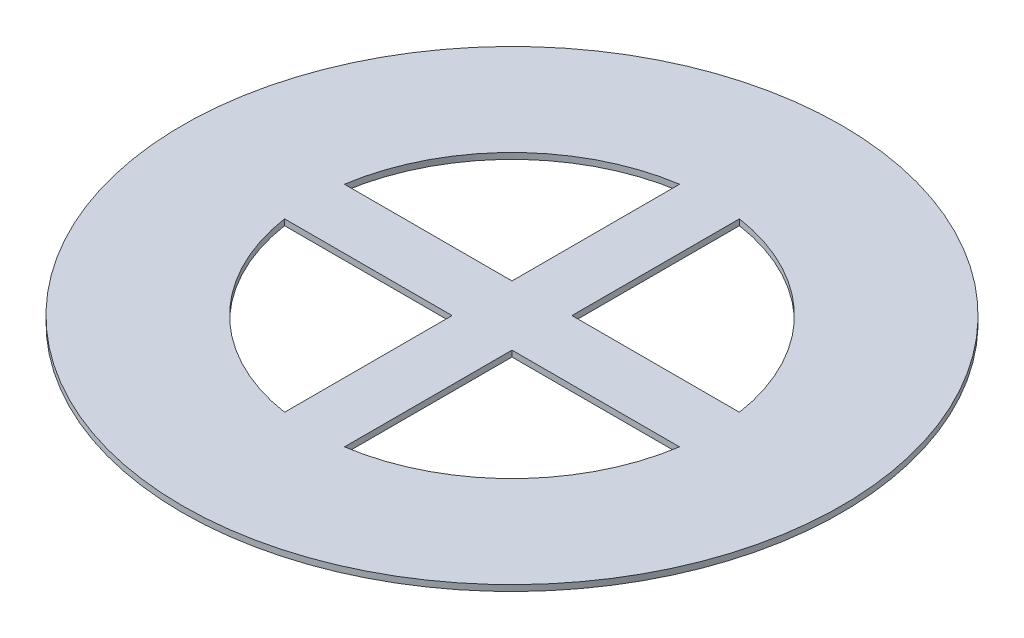
ISO-10303-21;
HEADER;
FILE_DESCRIPTION(('STEP AP214'),'2;1');
FILE_NAME('part.step','',(''),(''),'','','');
FILE_SCHEMA(('AUTOMOTIVE_DESIGN { 1 0 10303 214 1 1 1 1 }'));
ENDSEC;
DATA;
#1=APPLICATION_CONTEXT('core data for automotive mechanical design processes');
#2=APPLICATION_PROTOCOL_DEFINITION('international standard','automotive_design',2000,#1);
#3=PRODUCT_CONTEXT('',#1,'mechanical');
#4=PRODUCT('Part','Part','',(#3));
#5=PRODUCT_RELATED_PRODUCT_CATEGORY('part','',(#4));
#6=PRODUCT_DEFINITION_FORMATION('','',#4);
#7=PRODUCT_DEFINITION_CONTEXT('part definition',#1,'design');
#8=PRODUCT_DEFINITION('design','',#6,#7);
#9=PRODUCT_DEFINITION_SHAPE('','',#8);
#10=(LENGTH_UNIT() NAMED_UNIT(*) SI_UNIT(.MILLI.,.METRE.));
#11=(NAMED_UNIT(*) PLANE_ANGLE_UNIT() SI_UNIT($,.RADIAN.));
#12=(NAMED_UNIT(*) SI_UNIT($,.STERADIAN.) SOLID_ANGLE_UNIT());
#13=UNCERTAINTY_MEASURE_WITH_UNIT(LENGTH_MEASURE(1.E-05),#10,'distance_accuracy_value','');
#14=(GEOMETRIC_REPRESENTATION_CONTEXT(3) GLOBAL_UNCERTAINTY_ASSIGNED_CONTEXT((#13)) GLOBAL_UNIT_ASSIGNED_CONTEXT((#10,
#11,#12)) REPRESENTATION_CONTEXT('',''));
#15=CARTESIAN_POINT('',(0.,0.,0.));
#16=DIRECTION('',(0.,0.,1.));
#17=DIRECTION('',(1.,0.,0.));
#18=AXIS2_PLACEMENT_3D('',#15,#16,#17);
#19=CARTESIAN_POINT('',(0.,3.,0.));
#20=DIRECTION('',(0.,1.,0.));
#21=DIRECTION('',(0.,0.,1.));
#22=AXIS2_PLACEMENT_3D('',#19,#20,#21);
#23=PLANE('',#22);
#24=CARTESIAN_POINT('',(0.,3.,0.));
#25=DIRECTION('',(0.,1.,0.));
#26=DIRECTION('',(0.,0.,1.));
#27=AXIS2_PLACEMENT_3D('',#24,#25,#26);
#28=CIRCLE('',#27,165.);
#29=CARTESIAN_POINT('',(0.,3.,165.));
#30=VERTEX_POINT('',#29);
#31=EDGE_CURVE('E11',#30,#30,#28,.T.);
#32=ORIENTED_EDGE('',*,*,#31,.T.);
#33=EDGE_LOOP('',(#32));
#34=FACE_BOUND('',#33,.T.);
#35=DIRECTION('',(1.,0.,0.));
#36=VECTOR('',#35,1.);
#37=CARTESIAN_POINT('',(-98.868599666426,3.,-15.));
#38=LINE('',#37,#36);
#39=CARTESIAN_POINT('',(-98.868599666426,3.,-15.));
#40=VERTEX_POINT('',#39);
#41=CARTESIAN_POINT('',(-15.,3.,-15.));
#42=VERTEX_POINT('',#41);
#43=EDGE_CURVE('E234',#40,#42,#38,.T.);
#44=ORIENTED_EDGE('',*,*,#43,.F.);
#45=CARTESIAN_POINT('',(0.,3.,0.));
#46=DIRECTION('',(0.,1.,0.));
#47=DIRECTION('',(0.,0.,1.));
#48=AXIS2_PLACEMENT_3D('',#45,#46,#47);
#49=CIRCLE('',#48,100.);
#50=CARTESIAN_POINT('',(-15.,3.,-98.868599666426));
#51=VERTEX_POINT('',#50);
#52=EDGE_CURVE('E231',#51,#40,#49,.T.);
#53=ORIENTED_EDGE('',*,*,#52,.F.);
#54=DIRECTION('',(0.,0.,-1.));
#55=VECTOR('',#54,1.);
#56=CARTESIAN_POINT('',(-15.,3.,-98.868599666426));
#57=LINE('',#56,#55);
#58=EDGE_CURVE('E239',#42,#51,#57,.T.);
#59=ORIENTED_EDGE('',*,*,#58,.F.);
#60=EDGE_LOOP('',(#44,#53,#59));
#61=FACE_BOUND('',#60,.T.);
#62=DIRECTION('',(0.,0.,-1.));
#63=VECTOR('',#62,1.);
#64=CARTESIAN_POINT('',(-15.,3.,15.));
#65=LINE('',#64,#63);
#66=CARTESIAN_POINT('',(-15.,3.,98.868599666426));
#67=VERTEX_POINT('',#66);
#68=CARTESIAN_POINT('',(-15.,3.,15.));
#69=VERTEX_POINT('',#68);
#70=EDGE_CURVE('E201',#67,#69,#65,.T.);
#71=ORIENTED_EDGE('',*,*,#70,.F.);
#72=CARTESIAN_POINT('',(0.,3.,0.));
#73=DIRECTION('',(0.,1.,0.));
#74=DIRECTION('',(0.,0.,1.));
#75=AXIS2_PLACEMENT_3D('',#72,#73,#74);
#76=CIRCLE('',#75,100.);
#77=CARTESIAN_POINT('',(-98.868599666426,3.,15.));
#78=VERTEX_POINT('',#77);
#79=EDGE_CURVE('E198',#78,#67,#76,.T.);
#80=ORIENTED_EDGE('',*,*,#79,.F.);
#81=DIRECTION('',(-1.,0.,0.));
#82=VECTOR('',#81,1.);
#83=CARTESIAN_POINT('',(-98.868599666426,3.,15.));
#84=LINE('',#83,#82);
#85=EDGE_CURVE('E206',#69,#78,#84,.T.);
#86=ORIENTED_EDGE('',*,*,#85,.F.);
#87=EDGE_LOOP('',(#71,#80,#86));
#88=FACE_BOUND('',#87,.T.);
#89=CARTESIAN_POINT('',(0.,3.,0.));
#90=DIRECTION('',(0.,1.,0.));
#91=DIRECTION('',(0.,0.,1.));
#92=AXIS2_PLACEMENT_3D('',#89,#90,#91);
#93=CIRCLE('',#92,100.);
#94=CARTESIAN_POINT('',(98.868599666426,3.,-15.));
#95=VERTEX_POINT('',#94);
#96=CARTESIAN_POINT('',(15.,3.,-98.868599666426));
#97=VERTEX_POINT('',#96);
#98=EDGE_CURVE('E168',#95,#97,#93,.T.);
#99=ORIENTED_EDGE('',*,*,#98,.F.);
#100=DIRECTION('',(1.,0.,0.));
#101=VECTOR('',#100,1.);
#102=CARTESIAN_POINT('',(15.,3.,-15.));
#103=LINE('',#102,#101);
#104=CARTESIAN_POINT('',(15.,3.,-15.));
#105=VERTEX_POINT('',#104);
#106=EDGE_CURVE('E165',#105,#95,#103,.T.);
#107=ORIENTED_EDGE('',*,*,#106,.F.);
#108=DIRECTION('',(0.,0.,1.));
#109=VECTOR('',#108,1.);
#110=CARTESIAN_POINT('',(15.,3.,-98.868599666426));
#111=LINE('',#110,#109);
#112=EDGE_CURVE('E173',#97,#105,#111,.T.);
#113=ORIENTED_EDGE('',*,*,#112,.F.);
#114=EDGE_LOOP('',(#99,#107,#113));
#115=FACE_BOUND('',#114,.T.);
#116=DIRECTION('',(0.,0.,1.));
#117=VECTOR('',#116,1.);
#118=CARTESIAN_POINT('',(15.,3.,15.));
#119=LINE('',#118,#117);
#120=CARTESIAN_POINT('',(15.,3.,15.));
#121=VERTEX_POINT('',#120);
#122=CARTESIAN_POINT('',(15.,3.,98.868599666426));
#123=VERTEX_POINT('',#122);
#124=EDGE_CURVE('E138',#121,#123,#119,.T.);
#125=ORIENTED_EDGE('',*,*,#124,.F.);
#126=DIRECTION('',(-1.,0.,0.));
#127=VECTOR('',#126,1.);
#128=CARTESIAN_POINT('',(15.,3.,15.));
#129=LINE('',#128,#127);
#130=CARTESIAN_POINT('',(98.868599666426,3.,15.));
#131=VERTEX_POINT('',#130);
#132=EDGE_CURVE('E129',#131,#121,#129,.T.);
#133=ORIENTED_EDGE('',*,*,#132,.F.);
#134=CARTESIAN_POINT('',(0.,3.,0.));
#135=DIRECTION('',(0.,1.,0.));
#136=DIRECTION('',(0.,0.,1.));
#137=AXIS2_PLACEMENT_3D('',#134,#135,#136);
#138=CIRCLE('',#137,100.);
#139=EDGE_CURVE('E148',#123,#131,#138,.T.);
#140=ORIENTED_EDGE('',*,*,#139,.F.);
#141=EDGE_LOOP('',(#125,#133,#140));
#142=FACE_BOUND('',#141,.T.);
#143=ADVANCED_FACE('F39',(#34,#61,#88,#115,#142),#23,.T.);
#144=CARTESIAN_POINT('',(0.,0.,0.));
#145=DIRECTION('',(0.,1.,0.));
#146=DIRECTION('',(0.,0.,1.));
#147=AXIS2_PLACEMENT_3D('',#144,#145,#146);
#148=PLANE('',#147);
#149=DIRECTION('',(1.,0.,0.));
#150=VECTOR('',#149,1.);
#151=CARTESIAN_POINT('',(15.,0.,-15.));
#152=LINE('',#151,#150);
#153=CARTESIAN_POINT('',(15.,0.,-15.));
#154=VERTEX_POINT('',#153);
#155=CARTESIAN_POINT('',(98.868599666426,0.,-15.));
#156=VERTEX_POINT('',#155);
#157=EDGE_CURVE('E146',#154,#156,#152,.T.);
#158=ORIENTED_EDGE('',*,*,#157,.T.);
#159=CARTESIAN_POINT('',(0.,0.,0.));
#160=DIRECTION('',(0.,1.,0.));
#161=DIRECTION('',(0.,0.,1.));
#162=AXIS2_PLACEMENT_3D('',#159,#160,#161);
#163=CIRCLE('',#162,100.);
#164=CARTESIAN_POINT('',(15.,0.,-98.868599666426));
#165=VERTEX_POINT('',#164);
#166=EDGE_CURVE('E180',#156,#165,#163,.T.);
#167=ORIENTED_EDGE('',*,*,#166,.T.);
#168=DIRECTION('',(0.,0.,1.));
#169=VECTOR('',#168,1.);
#170=CARTESIAN_POINT('',(15.,0.,-98.868599666426));
#171=LINE('',#170,#169);
#172=EDGE_CURVE('E169',#165,#154,#171,.T.);
#173=ORIENTED_EDGE('',*,*,#172,.T.);
#174=EDGE_LOOP('',(#158,#167,#173));
#175=FACE_BOUND('',#174,.T.);
#176=CARTESIAN_POINT('',(0.,0.,0.));
#177=DIRECTION('',(0.,1.,0.));
#178=DIRECTION('',(0.,0.,1.));
#179=AXIS2_PLACEMENT_3D('',#176,#177,#178);
#180=CIRCLE('',#179,100.);
#181=CARTESIAN_POINT('',(-15.,0.,-98.868599666426));
#182=VERTEX_POINT('',#181);
#183=CARTESIAN_POINT('',(-98.868599666426,0.,-15.));
#184=VERTEX_POINT('',#183);
#185=EDGE_CURVE('E230',#182,#184,#180,.T.);
#186=ORIENTED_EDGE('',*,*,#185,.T.);
#187=DIRECTION('',(1.,0.,0.));
#188=VECTOR('',#187,1.);
#189=CARTESIAN_POINT('',(-98.868599666426,0.,-15.));
#190=LINE('',#189,#188);
#191=CARTESIAN_POINT('',(-15.,0.,-15.));
#192=VERTEX_POINT('',#191);
#193=EDGE_CURVE('E246',#184,#192,#190,.T.);
#194=ORIENTED_EDGE('',*,*,#193,.T.);
#195=DIRECTION('',(0.,0.,-1.));
#196=VECTOR('',#195,1.);
#197=CARTESIAN_POINT('',(-15.,0.,-98.868599666426));
#198=LINE('',#197,#196);
#199=EDGE_CURVE('E235',#192,#182,#198,.T.);
#200=ORIENTED_EDGE('',*,*,#199,.T.);
#201=EDGE_LOOP('',(#186,#194,#200));
#202=FACE_BOUND('',#201,.T.);
#203=CARTESIAN_POINT('',(0.,0.,0.));
#204=DIRECTION('',(0.,1.,0.));
#205=DIRECTION('',(0.,0.,1.));
#206=AXIS2_PLACEMENT_3D('',#203,#204,#205);
#207=CIRCLE('',#206,165.);
#208=CARTESIAN_POINT('',(0.,0.,165.));
#209=VERTEX_POINT('',#208);
#210=EDGE_CURVE('E43',#209,#209,#207,.T.);
#211=ORIENTED_EDGE('',*,*,#210,.F.);
#212=EDGE_LOOP('',(#211));
#213=FACE_BOUND('',#212,.T.);
#214=CARTESIAN_POINT('',(0.,0.,0.));
#215=DIRECTION('',(0.,1.,0.));
#216=DIRECTION('',(0.,0.,1.));
#217=AXIS2_PLACEMENT_3D('',#214,#215,#216);
#218=CIRCLE('',#217,100.);
#219=CARTESIAN_POINT('',(-98.868599666426,0.,15.));
#220=VERTEX_POINT('',#219);
#221=CARTESIAN_POINT('',(-15.,0.,98.868599666426));
#222=VERTEX_POINT('',#221);
#223=EDGE_CURVE('E197',#220,#222,#218,.T.);
#224=ORIENTED_EDGE('',*,*,#223,.T.);
#225=DIRECTION('',(0.,0.,-1.));
#226=VECTOR('',#225,1.);
#227=CARTESIAN_POINT('',(-15.,0.,15.));
#228=LINE('',#227,#226);
#229=CARTESIAN_POINT('',(-15.,0.,15.));
#230=VERTEX_POINT('',#229);
#231=EDGE_CURVE('E213',#222,#230,#228,.T.);
#232=ORIENTED_EDGE('',*,*,#231,.T.);
#233=DIRECTION('',(-1.,0.,0.));
#234=VECTOR('',#233,1.);
#235=CARTESIAN_POINT('',(-98.868599666426,0.,15.));
#236=LINE('',#235,#234);
#237=EDGE_CURVE('E202',#230,#220,#236,.T.);
#238=ORIENTED_EDGE('',*,*,#237,.T.);
#239=EDGE_LOOP('',(#224,#232,#238));
#240=FACE_BOUND('',#239,.T.);
#241=DIRECTION('',(-1.,0.,0.));
#242=VECTOR('',#241,1.);
#243=CARTESIAN_POINT('',(15.,0.,15.));
#244=LINE('',#243,#242);
#245=CARTESIAN_POINT('',(98.868599666426,0.,15.));
#246=VERTEX_POINT('',#245);
#247=CARTESIAN_POINT('',(15.,0.,15.));
#248=VERTEX_POINT('',#247);
#249=EDGE_CURVE('E63',#246,#248,#244,.T.);
#250=ORIENTED_EDGE('',*,*,#249,.T.);
#251=DIRECTION('',(0.,0.,1.));
#252=VECTOR('',#251,1.);
#253=CARTESIAN_POINT('',(15.,0.,15.));
#254=LINE('',#253,#252);
#255=CARTESIAN_POINT('',(15.,0.,98.868599666426));
#256=VERTEX_POINT('',#255);
#257=EDGE_CURVE('E144',#248,#256,#254,.T.);
#258=ORIENTED_EDGE('',*,*,#257,.T.);
#259=CARTESIAN_POINT('',(0.,0.,0.));
#260=DIRECTION('',(0.,1.,0.));
#261=DIRECTION('',(0.,0.,1.));
#262=AXIS2_PLACEMENT_3D('',#259,#260,#261);
#263=CIRCLE('',#262,100.);
#264=EDGE_CURVE('E139',#256,#246,#263,.T.);
#265=ORIENTED_EDGE('',*,*,#264,.T.);
#266=EDGE_LOOP('',(#250,#258,#265));
#267=FACE_BOUND('',#266,.T.);
#268=ADVANCED_FACE('F269',(#175,#202,#213,#240,#267),#148,.F.);
#269=CARTESIAN_POINT('',(0.,3.,0.));
#270=DIRECTION('',(0.,-1.,0.));
#271=DIRECTION('',(0.,0.,-1.));
#272=AXIS2_PLACEMENT_3D('',#269,#270,#271);
#273=CYLINDRICAL_SURFACE('',#272,165.);
#274=ORIENTED_EDGE('',*,*,#31,.F.);
#275=EDGE_LOOP('',(#274));
#276=FACE_BOUND('',#275,.T.);
#277=ORIENTED_EDGE('',*,*,#210,.T.);
#278=EDGE_LOOP('',(#277));
#279=FACE_BOUND('',#278,.T.);
#280=ADVANCED_FACE('F41',(#276,#279),#273,.T.);
#281=CARTESIAN_POINT('',(0.,3.,0.));
#282=DIRECTION('',(0.,-1.,0.));
#283=DIRECTION('',(0.,0.,-1.));
#284=AXIS2_PLACEMENT_3D('',#281,#282,#283);
#285=CYLINDRICAL_SURFACE('',#284,100.);
#286=ORIENTED_EDGE('',*,*,#185,.F.);
#287=DIRECTION('',(0.,-1.,0.));
#288=VECTOR('',#287,1.);
#289=CARTESIAN_POINT('',(-15.,3.,-98.868599666426));
#290=LINE('',#289,#288);
#291=EDGE_CURVE('E242',#51,#182,#290,.T.);
#292=ORIENTED_EDGE('',*,*,#291,.F.);
#293=ORIENTED_EDGE('',*,*,#52,.T.);
#294=DIRECTION('',(0.,-1.,0.));
#295=VECTOR('',#294,1.);
#296=CARTESIAN_POINT('',(-98.868599666426,3.,-15.));
#297=LINE('',#296,#295);
#298=EDGE_CURVE('E259',#40,#184,#297,.T.);
#299=ORIENTED_EDGE('',*,*,#298,.T.);
#300=EDGE_LOOP('',(#286,#292,#293,#299));
#301=FACE_BOUND('',#300,.T.);
#302=ADVANCED_FACE('F288',(#301),#285,.F.);
#303=CARTESIAN_POINT('',(-98.868599666426,3.,-15.));
#304=DIRECTION('',(0.,0.,-1.));
#305=DIRECTION('',(-1.,0.,0.));
#306=AXIS2_PLACEMENT_3D('',#303,#304,#305);
#307=PLANE('',#306);
#308=ORIENTED_EDGE('',*,*,#193,.F.);
#309=ORIENTED_EDGE('',*,*,#298,.F.);
#310=ORIENTED_EDGE('',*,*,#43,.T.);
#311=DIRECTION('',(0.,-1.,0.));
#312=VECTOR('',#311,1.);
#313=CARTESIAN_POINT('',(-15.,3.,-15.));
#314=LINE('',#313,#312);
#315=EDGE_CURVE('E256',#42,#192,#314,.T.);
#316=ORIENTED_EDGE('',*,*,#315,.T.);
#317=EDGE_LOOP('',(#308,#309,#310,#316));
#318=FACE_BOUND('',#317,.T.);
#319=ADVANCED_FACE('F291',(#318),#307,.T.);
#320=CARTESIAN_POINT('',(-15.,3.,-98.868599666426));
#321=DIRECTION('',(-1.,0.,0.));
#322=DIRECTION('',(0.,0.,1.));
#323=AXIS2_PLACEMENT_3D('',#320,#321,#322);
#324=PLANE('',#323);
#325=ORIENTED_EDGE('',*,*,#199,.F.);
#326=ORIENTED_EDGE('',*,*,#315,.F.);
#327=ORIENTED_EDGE('',*,*,#58,.T.);
#328=ORIENTED_EDGE('',*,*,#291,.T.);
#329=EDGE_LOOP('',(#325,#326,#327,#328));
#330=FACE_BOUND('',#329,.T.);
#331=ADVANCED_FACE('F294',(#330),#324,.T.);
#332=CARTESIAN_POINT('',(0.,3.,0.));
#333=DIRECTION('',(0.,-1.,0.));
#334=DIRECTION('',(0.,0.,-1.));
#335=AXIS2_PLACEMENT_3D('',#332,#333,#334);
#336=CYLINDRICAL_SURFACE('',#335,100.);
#337=ORIENTED_EDGE('',*,*,#223,.F.);
#338=DIRECTION('',(0.,-1.,0.));
#339=VECTOR('',#338,1.);
#340=CARTESIAN_POINT('',(-98.868599666426,3.,15.));
#341=LINE('',#340,#339);
#342=EDGE_CURVE('E209',#78,#220,#341,.T.);
#343=ORIENTED_EDGE('',*,*,#342,.F.);
#344=ORIENTED_EDGE('',*,*,#79,.T.);
#345=DIRECTION('',(0.,-1.,0.));
#346=VECTOR('',#345,1.);
#347=CARTESIAN_POINT('',(-15.,3.,98.868599666426));
#348=LINE('',#347,#346);
#349=EDGE_CURVE('E226',#67,#222,#348,.T.);
#350=ORIENTED_EDGE('',*,*,#349,.T.);
#351=EDGE_LOOP('',(#337,#343,#344,#350));
#352=FACE_BOUND('',#351,.T.);
#353=ADVANCED_FACE('F298',(#352),#336,.F.);
#354=CARTESIAN_POINT('',(-15.,3.,15.));
#355=DIRECTION('',(-1.,0.,0.));
#356=DIRECTION('',(0.,0.,1.));
#357=AXIS2_PLACEMENT_3D('',#354,#355,#356);
#358=PLANE('',#357);
#359=ORIENTED_EDGE('',*,*,#231,.F.);
#360=ORIENTED_EDGE('',*,*,#349,.F.);
#361=ORIENTED_EDGE('',*,*,#70,.T.);
#362=DIRECTION('',(0.,-1.,0.));
#363=VECTOR('',#362,1.);
#364=CARTESIAN_POINT('',(-15.,3.,15.));
#365=LINE('',#364,#363);
#366=EDGE_CURVE('E223',#69,#230,#365,.T.);
#367=ORIENTED_EDGE('',*,*,#366,.T.);
#368=EDGE_LOOP('',(#359,#360,#361,#367));
#369=FACE_BOUND('',#368,.T.);
#370=ADVANCED_FACE('F302',(#369),#358,.T.);
#371=CARTESIAN_POINT('',(-98.868599666426,3.,15.));
#372=DIRECTION('',(0.,0.,1.));
#373=DIRECTION('',(1.,0.,0.));
#374=AXIS2_PLACEMENT_3D('',#371,#372,#373);
#375=PLANE('',#374);
#376=ORIENTED_EDGE('',*,*,#237,.F.);
#377=ORIENTED_EDGE('',*,*,#366,.F.);
#378=ORIENTED_EDGE('',*,*,#85,.T.);
#379=ORIENTED_EDGE('',*,*,#342,.T.);
#380=EDGE_LOOP('',(#376,#377,#378,#379));
#381=FACE_BOUND('',#380,.T.);
#382=ADVANCED_FACE('F306',(#381),#375,.T.);
#383=CARTESIAN_POINT('',(15.,3.,-15.));
#384=DIRECTION('',(0.,0.,-1.));
#385=DIRECTION('',(-1.,0.,0.));
#386=AXIS2_PLACEMENT_3D('',#383,#384,#385);
#387=PLANE('',#386);
#388=ORIENTED_EDGE('',*,*,#157,.F.);
#389=DIRECTION('',(0.,-1.,0.));
#390=VECTOR('',#389,1.);
#391=CARTESIAN_POINT('',(15.,3.,-15.));
#392=LINE('',#391,#390);
#393=EDGE_CURVE('E176',#105,#154,#392,.T.);
#394=ORIENTED_EDGE('',*,*,#393,.F.);
#395=ORIENTED_EDGE('',*,*,#106,.T.);
#396=DIRECTION('',(0.,-1.,0.));
#397=VECTOR('',#396,1.);
#398=CARTESIAN_POINT('',(98.868599666426,3.,-15.));
#399=LINE('',#398,#397);
#400=EDGE_CURVE('E193',#95,#156,#399,.T.);
#401=ORIENTED_EDGE('',*,*,#400,.T.);
#402=EDGE_LOOP('',(#388,#394,#395,#401));
#403=FACE_BOUND('',#402,.T.);
#404=ADVANCED_FACE('F310',(#403),#387,.T.);
#405=CARTESIAN_POINT('',(0.,3.,0.));
#406=DIRECTION('',(0.,-1.,0.));
#407=DIRECTION('',(0.,0.,-1.));
#408=AXIS2_PLACEMENT_3D('',#405,#406,#407);
#409=CYLINDRICAL_SURFACE('',#408,100.);
#410=ORIENTED_EDGE('',*,*,#166,.F.);
#411=ORIENTED_EDGE('',*,*,#400,.F.);
#412=ORIENTED_EDGE('',*,*,#98,.T.);
#413=DIRECTION('',(0.,-1.,0.));
#414=VECTOR('',#413,1.);
#415=CARTESIAN_POINT('',(15.,3.,-98.868599666426));
#416=LINE('',#415,#414);
#417=EDGE_CURVE('E190',#97,#165,#416,.T.);
#418=ORIENTED_EDGE('',*,*,#417,.T.);
#419=EDGE_LOOP('',(#410,#411,#412,#418));
#420=FACE_BOUND('',#419,.T.);
#421=ADVANCED_FACE('F314',(#420),#409,.F.);
#422=CARTESIAN_POINT('',(15.,3.,-98.868599666426));
#423=DIRECTION('',(1.,0.,0.));
#424=DIRECTION('',(0.,0.,-1.));
#425=AXIS2_PLACEMENT_3D('',#422,#423,#424);
#426=PLANE('',#425);
#427=ORIENTED_EDGE('',*,*,#172,.F.);
#428=ORIENTED_EDGE('',*,*,#417,.F.);
#429=ORIENTED_EDGE('',*,*,#112,.T.);
#430=ORIENTED_EDGE('',*,*,#393,.T.);
#431=EDGE_LOOP('',(#427,#428,#429,#430));
#432=FACE_BOUND('',#431,.T.);
#433=ADVANCED_FACE('F318',(#432),#426,.T.);
#434=CARTESIAN_POINT('',(15.,3.,15.));
#435=DIRECTION('',(0.,0.,1.));
#436=DIRECTION('',(1.,0.,0.));
#437=AXIS2_PLACEMENT_3D('',#434,#435,#436);
#438=PLANE('',#437);
#439=ORIENTED_EDGE('',*,*,#249,.F.);
#440=DIRECTION('',(0.,-1.,0.));
#441=VECTOR('',#440,1.);
#442=CARTESIAN_POINT('',(98.868599666426,3.,15.));
#443=LINE('',#442,#441);
#444=EDGE_CURVE('E133',#131,#246,#443,.T.);
#445=ORIENTED_EDGE('',*,*,#444,.F.);
#446=ORIENTED_EDGE('',*,*,#132,.T.);
#447=DIRECTION('',(0.,-1.,0.));
#448=VECTOR('',#447,1.);
#449=CARTESIAN_POINT('',(15.,3.,15.));
#450=LINE('',#449,#448);
#451=EDGE_CURVE('E132',#121,#248,#450,.T.);
#452=ORIENTED_EDGE('',*,*,#451,.T.);
#453=EDGE_LOOP('',(#439,#445,#446,#452));
#454=FACE_BOUND('',#453,.T.);
#455=ADVANCED_FACE('F131',(#454),#438,.T.);
#456=CARTESIAN_POINT('',(15.,3.,15.));
#457=DIRECTION('',(1.,0.,0.));
#458=DIRECTION('',(0.,0.,-1.));
#459=AXIS2_PLACEMENT_3D('',#456,#457,#458);
#460=PLANE('',#459);
#461=ORIENTED_EDGE('',*,*,#257,.F.);
#462=ORIENTED_EDGE('',*,*,#451,.F.);
#463=ORIENTED_EDGE('',*,*,#124,.T.);
#464=DIRECTION('',(0.,-1.,0.));
#465=VECTOR('',#464,1.);
#466=CARTESIAN_POINT('',(15.,3.,98.868599666426));
#467=LINE('',#466,#465);
#468=EDGE_CURVE('E55',#123,#256,#467,.T.);
#469=ORIENTED_EDGE('',*,*,#468,.T.);
#470=EDGE_LOOP('',(#461,#462,#463,#469));
#471=FACE_BOUND('',#470,.T.);
#472=ADVANCED_FACE('F142',(#471),#460,.T.);
#473=CARTESIAN_POINT('',(0.,3.,0.));
#474=DIRECTION('',(0.,-1.,0.));
#475=DIRECTION('',(0.,0.,-1.));
#476=AXIS2_PLACEMENT_3D('',#473,#474,#475);
#477=CYLINDRICAL_SURFACE('',#476,100.);
#478=ORIENTED_EDGE('',*,*,#264,.F.);
#479=ORIENTED_EDGE('',*,*,#468,.F.);
#480=ORIENTED_EDGE('',*,*,#139,.T.);
#481=ORIENTED_EDGE('',*,*,#444,.T.);
#482=EDGE_LOOP('',(#478,#479,#480,#481));
#483=FACE_BOUND('',#482,.T.);
#484=ADVANCED_FACE('F274',(#483),#477,.F.);
#485=CLOSED_SHELL('',(#143,#268,#280,#302,#319,#331,#353,#370,#382,#404,#421,#433,#455,#472,#484));
#486=MANIFOLD_SOLID_BREP('B2',#485);
#487=ADVANCED_BREP_SHAPE_REPRESENTATION('',(#18,#486),#14);
#488=SHAPE_DEFINITION_REPRESENTATION(#9,#487);
ENDSEC;
END-ISO-10303-21;
